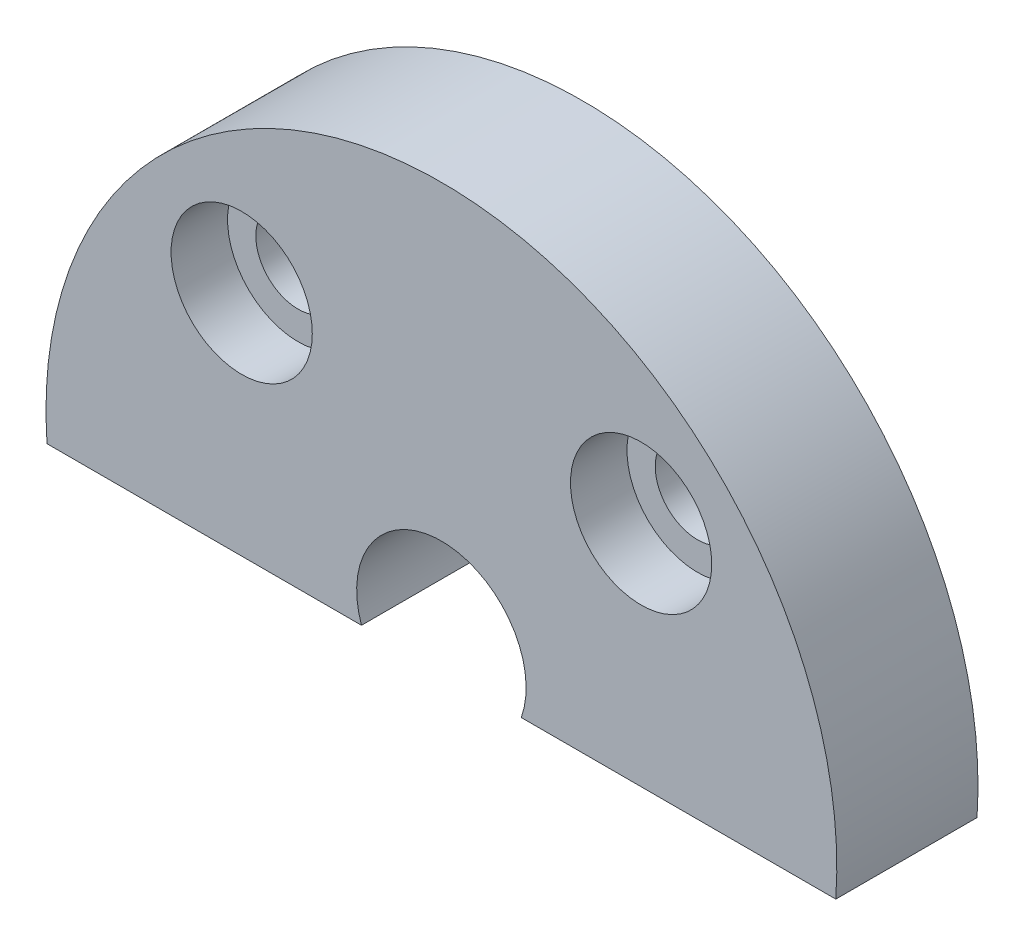
ISO-10303-21;
HEADER;
FILE_DESCRIPTION(('STEP AP214'),'2;1');
FILE_NAME('part.step','',(''),(''),'','','');
FILE_SCHEMA(('AUTOMOTIVE_DESIGN { 1 0 10303 214 1 1 1 1 }'));
ENDSEC;
DATA;
#1=APPLICATION_CONTEXT('core data for automotive mechanical design processes');
#2=APPLICATION_PROTOCOL_DEFINITION('international standard','automotive_design',2000,#1);
#3=PRODUCT_CONTEXT('',#1,'mechanical');
#4=PRODUCT('Part','Part','',(#3));
#5=PRODUCT_RELATED_PRODUCT_CATEGORY('part','',(#4));
#6=PRODUCT_DEFINITION_FORMATION('','',#4);
#7=PRODUCT_DEFINITION_CONTEXT('part definition',#1,'design');
#8=PRODUCT_DEFINITION('design','',#6,#7);
#9=PRODUCT_DEFINITION_SHAPE('','',#8);
#10=(LENGTH_UNIT() NAMED_UNIT(*) SI_UNIT(.MILLI.,.METRE.));
#11=(NAMED_UNIT(*) PLANE_ANGLE_UNIT() SI_UNIT($,.RADIAN.));
#12=(NAMED_UNIT(*) SI_UNIT($,.STERADIAN.) SOLID_ANGLE_UNIT());
#13=UNCERTAINTY_MEASURE_WITH_UNIT(LENGTH_MEASURE(1.E-05),#10,'distance_accuracy_value','');
#14=(GEOMETRIC_REPRESENTATION_CONTEXT(3) GLOBAL_UNCERTAINTY_ASSIGNED_CONTEXT((#13)) GLOBAL_UNIT_ASSIGNED_CONTEXT((#10,
#11,#12)) REPRESENTATION_CONTEXT('',''));
#15=CARTESIAN_POINT('',(0.,0.,0.));
#16=DIRECTION('',(0.,0.,1.));
#17=DIRECTION('',(1.,0.,0.));
#18=AXIS2_PLACEMENT_3D('',#15,#16,#17);
#19=CARTESIAN_POINT('',(7.07106781186548,7.07106781186548,5.));
#20=DIRECTION('',(0.,0.,-1.));
#21=DIRECTION('',(-1.,0.,0.));
#22=AXIS2_PLACEMENT_3D('',#19,#20,#21);
#23=CYLINDRICAL_SURFACE('',#22,1.5);
#24=CARTESIAN_POINT('',(7.07106781186548,7.07106781186548,0.));
#25=DIRECTION('',(0.,0.,1.));
#26=DIRECTION('',(1.,0.,0.));
#27=AXIS2_PLACEMENT_3D('',#24,#25,#26);
#28=CIRCLE('',#27,1.5);
#29=CARTESIAN_POINT('',(8.57106781186548,7.07106781186548,0.));
#30=VERTEX_POINT('',#29);
#31=EDGE_CURVE('E109',#30,#30,#28,.T.);
#32=ORIENTED_EDGE('',*,*,#31,.F.);
#33=EDGE_LOOP('',(#32));
#34=FACE_BOUND('',#33,.T.);
#35=CARTESIAN_POINT('',(7.07106781186548,7.07106781186548,3.));
#36=DIRECTION('',(0.,0.,1.));
#37=DIRECTION('',(1.,0.,0.));
#38=AXIS2_PLACEMENT_3D('',#35,#36,#37);
#39=CIRCLE('',#38,1.5);
#40=CARTESIAN_POINT('',(8.57106781186548,7.07106781186548,3.));
#41=VERTEX_POINT('',#40);
#42=EDGE_CURVE('E36',#41,#41,#39,.T.);
#43=ORIENTED_EDGE('',*,*,#42,.T.);
#44=EDGE_LOOP('',(#43));
#45=FACE_BOUND('',#44,.T.);
#46=ADVANCED_FACE('F32',(#34,#45),#23,.F.);
#47=CARTESIAN_POINT('',(-7.07106781186548,7.07106781186548,5.));
#48=DIRECTION('',(0.,0.,-1.));
#49=DIRECTION('',(-1.,0.,0.));
#50=AXIS2_PLACEMENT_3D('',#47,#48,#49);
#51=CYLINDRICAL_SURFACE('',#50,1.5);
#52=CARTESIAN_POINT('',(-7.07106781186548,7.07106781186548,0.));
#53=DIRECTION('',(0.,0.,1.));
#54=DIRECTION('',(1.,0.,0.));
#55=AXIS2_PLACEMENT_3D('',#52,#53,#54);
#56=CIRCLE('',#55,1.5);
#57=CARTESIAN_POINT('',(-5.57106781186548,7.07106781186548,0.));
#58=VERTEX_POINT('',#57);
#59=EDGE_CURVE('E102',#58,#58,#56,.T.);
#60=ORIENTED_EDGE('',*,*,#59,.F.);
#61=EDGE_LOOP('',(#60));
#62=FACE_BOUND('',#61,.T.);
#63=CARTESIAN_POINT('',(-7.07106781186548,7.07106781186548,3.));
#64=DIRECTION('',(0.,0.,1.));
#65=DIRECTION('',(1.,0.,0.));
#66=AXIS2_PLACEMENT_3D('',#63,#64,#65);
#67=CIRCLE('',#66,1.5);
#68=CARTESIAN_POINT('',(-5.57106781186548,7.07106781186548,3.));
#69=VERTEX_POINT('',#68);
#70=EDGE_CURVE('E107',#69,#69,#67,.T.);
#71=ORIENTED_EDGE('',*,*,#70,.T.);
#72=EDGE_LOOP('',(#71));
#73=FACE_BOUND('',#72,.T.);
#74=ADVANCED_FACE('F132',(#62,#73),#51,.F.);
#75=CARTESIAN_POINT('',(0.,0.,5.));
#76=DIRECTION('',(0.,0.,1.));
#77=DIRECTION('',(1.,0.,0.));
#78=AXIS2_PLACEMENT_3D('',#75,#76,#77);
#79=PLANE('',#78);
#80=CARTESIAN_POINT('',(7.07106781186548,7.07106781186548,5.));
#81=DIRECTION('',(0.,0.,1.));
#82=DIRECTION('',(1.,0.,0.));
#83=AXIS2_PLACEMENT_3D('',#80,#81,#82);
#84=CIRCLE('',#83,2.5);
#85=CARTESIAN_POINT('',(9.57106781186548,7.07106781186548,5.));
#86=VERTEX_POINT('',#85);
#87=EDGE_CURVE('E123',#86,#86,#84,.T.);
#88=ORIENTED_EDGE('',*,*,#87,.F.);
#89=EDGE_LOOP('',(#88));
#90=FACE_BOUND('',#89,.T.);
#91=CARTESIAN_POINT('',(-7.07106781186548,7.07106781186548,5.));
#92=DIRECTION('',(0.,0.,1.));
#93=DIRECTION('',(1.,0.,0.));
#94=AXIS2_PLACEMENT_3D('',#91,#92,#93);
#95=CIRCLE('',#94,2.5);
#96=CARTESIAN_POINT('',(-4.57106781186548,7.07106781186548,5.));
#97=VERTEX_POINT('',#96);
#98=EDGE_CURVE('E116',#97,#97,#95,.T.);
#99=ORIENTED_EDGE('',*,*,#98,.F.);
#100=EDGE_LOOP('',(#99));
#101=FACE_BOUND('',#100,.T.);
#102=CARTESIAN_POINT('',(0.,0.,5.));
#103=DIRECTION('',(0.,0.,1.));
#104=DIRECTION('',(1.,0.,0.));
#105=AXIS2_PLACEMENT_3D('',#102,#103,#104);
#106=CIRCLE('',#105,14.);
#107=CARTESIAN_POINT('',(13.9642400437689,-1.,5.));
#108=VERTEX_POINT('',#107);
#109=CARTESIAN_POINT('',(-13.9642400437689,-1.,5.));
#110=VERTEX_POINT('',#109);
#111=EDGE_CURVE('E86',#108,#110,#106,.T.);
#112=ORIENTED_EDGE('',*,*,#111,.T.);
#113=DIRECTION('',(1.,0.,0.));
#114=VECTOR('',#113,1.);
#115=CARTESIAN_POINT('',(-13.9642400437689,-1.,5.));
#116=LINE('',#115,#114);
#117=CARTESIAN_POINT('',(-2.82842712474619,-1.,5.));
#118=VERTEX_POINT('',#117);
#119=EDGE_CURVE('E81',#110,#118,#116,.T.);
#120=ORIENTED_EDGE('',*,*,#119,.T.);
#121=CARTESIAN_POINT('',(0.,0.,5.));
#122=DIRECTION('',(0.,0.,-1.));
#123=DIRECTION('',(1.,0.,0.));
#124=AXIS2_PLACEMENT_3D('',#121,#122,#123);
#125=CIRCLE('',#124,3.);
#126=CARTESIAN_POINT('',(2.82842712474619,-1.,5.));
#127=VERTEX_POINT('',#126);
#128=EDGE_CURVE('E84',#118,#127,#125,.T.);
#129=ORIENTED_EDGE('',*,*,#128,.T.);
#130=DIRECTION('',(1.,0.,0.));
#131=VECTOR('',#130,1.);
#132=CARTESIAN_POINT('',(2.82842712474619,-1.,5.));
#133=LINE('',#132,#131);
#134=EDGE_CURVE('E51',#127,#108,#133,.T.);
#135=ORIENTED_EDGE('',*,*,#134,.T.);
#136=EDGE_LOOP('',(#112,#120,#129,#135));
#137=FACE_BOUND('',#136,.T.);
#138=ADVANCED_FACE('F82',(#90,#101,#137),#79,.T.);
#139=CARTESIAN_POINT('',(0.,0.,0.));
#140=DIRECTION('',(0.,0.,1.));
#141=DIRECTION('',(1.,0.,0.));
#142=AXIS2_PLACEMENT_3D('',#139,#140,#141);
#143=PLANE('',#142);
#144=ORIENTED_EDGE('',*,*,#59,.T.);
#145=EDGE_LOOP('',(#144));
#146=FACE_BOUND('',#145,.T.);
#147=CARTESIAN_POINT('',(0.,0.,0.));
#148=DIRECTION('',(0.,0.,1.));
#149=DIRECTION('',(1.,0.,0.));
#150=AXIS2_PLACEMENT_3D('',#147,#148,#149);
#151=CIRCLE('',#150,14.);
#152=CARTESIAN_POINT('',(13.9642400437689,-1.,0.));
#153=VERTEX_POINT('',#152);
#154=CARTESIAN_POINT('',(-13.9642400437689,-1.,0.));
#155=VERTEX_POINT('',#154);
#156=EDGE_CURVE('E99',#153,#155,#151,.T.);
#157=ORIENTED_EDGE('',*,*,#156,.F.);
#158=DIRECTION('',(1.,0.,0.));
#159=VECTOR('',#158,1.);
#160=CARTESIAN_POINT('',(2.82842712474619,-1.,0.));
#161=LINE('',#160,#159);
#162=CARTESIAN_POINT('',(2.82842712474619,-1.,0.));
#163=VERTEX_POINT('',#162);
#164=EDGE_CURVE('E74',#163,#153,#161,.T.);
#165=ORIENTED_EDGE('',*,*,#164,.F.);
#166=CARTESIAN_POINT('',(0.,0.,0.));
#167=DIRECTION('',(0.,0.,-1.));
#168=DIRECTION('',(1.,0.,0.));
#169=AXIS2_PLACEMENT_3D('',#166,#167,#168);
#170=CIRCLE('',#169,3.);
#171=CARTESIAN_POINT('',(-2.82842712474619,-1.,0.));
#172=VERTEX_POINT('',#171);
#173=EDGE_CURVE('E68',#172,#163,#170,.T.);
#174=ORIENTED_EDGE('',*,*,#173,.F.);
#175=DIRECTION('',(1.,0.,0.));
#176=VECTOR('',#175,1.);
#177=CARTESIAN_POINT('',(-13.9642400437689,-1.,0.));
#178=LINE('',#177,#176);
#179=EDGE_CURVE('E90',#155,#172,#178,.T.);
#180=ORIENTED_EDGE('',*,*,#179,.F.);
#181=EDGE_LOOP('',(#157,#165,#174,#180));
#182=FACE_BOUND('',#181,.T.);
#183=ORIENTED_EDGE('',*,*,#31,.T.);
#184=EDGE_LOOP('',(#183));
#185=FACE_BOUND('',#184,.T.);
#186=ADVANCED_FACE('F129',(#146,#182,#185),#143,.F.);
#187=CARTESIAN_POINT('',(0.,0.,5.));
#188=DIRECTION('',(0.,0.,-1.));
#189=DIRECTION('',(-1.,0.,0.));
#190=AXIS2_PLACEMENT_3D('',#187,#188,#189);
#191=CYLINDRICAL_SURFACE('',#190,14.);
#192=ORIENTED_EDGE('',*,*,#156,.T.);
#193=DIRECTION('',(0.,0.,-1.));
#194=VECTOR('',#193,1.);
#195=CARTESIAN_POINT('',(-13.9642400437689,-1.,5.));
#196=LINE('',#195,#194);
#197=EDGE_CURVE('E11',#110,#155,#196,.T.);
#198=ORIENTED_EDGE('',*,*,#197,.F.);
#199=ORIENTED_EDGE('',*,*,#111,.F.);
#200=DIRECTION('',(0.,0.,-1.));
#201=VECTOR('',#200,1.);
#202=CARTESIAN_POINT('',(13.9642400437689,-1.,5.));
#203=LINE('',#202,#201);
#204=EDGE_CURVE('E95',#108,#153,#203,.T.);
#205=ORIENTED_EDGE('',*,*,#204,.T.);
#206=EDGE_LOOP('',(#192,#198,#199,#205));
#207=FACE_BOUND('',#206,.T.);
#208=ADVANCED_FACE('F34',(#207),#191,.T.);
#209=CARTESIAN_POINT('',(-13.9642400437689,-1.,5.));
#210=DIRECTION('',(0.,1.,0.));
#211=DIRECTION('',(0.,0.,1.));
#212=AXIS2_PLACEMENT_3D('',#209,#210,#211);
#213=PLANE('',#212);
#214=ORIENTED_EDGE('',*,*,#179,.T.);
#215=DIRECTION('',(0.,0.,-1.));
#216=VECTOR('',#215,1.);
#217=CARTESIAN_POINT('',(-2.82842712474619,-1.,5.));
#218=LINE('',#217,#216);
#219=EDGE_CURVE('E42',#118,#172,#218,.T.);
#220=ORIENTED_EDGE('',*,*,#219,.F.);
#221=ORIENTED_EDGE('',*,*,#119,.F.);
#222=ORIENTED_EDGE('',*,*,#197,.T.);
#223=EDGE_LOOP('',(#214,#220,#221,#222));
#224=FACE_BOUND('',#223,.T.);
#225=ADVANCED_FACE('F89',(#224),#213,.F.);
#226=CARTESIAN_POINT('',(0.,0.,5.));
#227=DIRECTION('',(0.,0.,-1.));
#228=DIRECTION('',(-1.,0.,0.));
#229=AXIS2_PLACEMENT_3D('',#226,#227,#228);
#230=CYLINDRICAL_SURFACE('',#229,3.);
#231=ORIENTED_EDGE('',*,*,#173,.T.);
#232=DIRECTION('',(0.,0.,-1.));
#233=VECTOR('',#232,1.);
#234=CARTESIAN_POINT('',(2.82842712474619,-1.,5.));
#235=LINE('',#234,#233);
#236=EDGE_CURVE('E91',#127,#163,#235,.T.);
#237=ORIENTED_EDGE('',*,*,#236,.F.);
#238=ORIENTED_EDGE('',*,*,#128,.F.);
#239=ORIENTED_EDGE('',*,*,#219,.T.);
#240=EDGE_LOOP('',(#231,#237,#238,#239));
#241=FACE_BOUND('',#240,.T.);
#242=ADVANCED_FACE('F93',(#241),#230,.F.);
#243=CARTESIAN_POINT('',(2.82842712474619,-1.,5.));
#244=DIRECTION('',(0.,1.,0.));
#245=DIRECTION('',(0.,0.,1.));
#246=AXIS2_PLACEMENT_3D('',#243,#244,#245);
#247=PLANE('',#246);
#248=ORIENTED_EDGE('',*,*,#164,.T.);
#249=ORIENTED_EDGE('',*,*,#204,.F.);
#250=ORIENTED_EDGE('',*,*,#134,.F.);
#251=ORIENTED_EDGE('',*,*,#236,.T.);
#252=EDGE_LOOP('',(#248,#249,#250,#251));
#253=FACE_BOUND('',#252,.T.);
#254=ADVANCED_FACE('F147',(#253),#247,.F.);
#255=CARTESIAN_POINT('',(-7.07106781186548,7.07106781186548,3.));
#256=DIRECTION('',(0.,0.,1.));
#257=DIRECTION('',(1.,0.,0.));
#258=AXIS2_PLACEMENT_3D('',#255,#256,#257);
#259=CYLINDRICAL_SURFACE('',#258,2.5);
#260=CARTESIAN_POINT('',(-7.07106781186548,7.07106781186548,3.));
#261=DIRECTION('',(0.,0.,1.));
#262=DIRECTION('',(1.,0.,0.));
#263=AXIS2_PLACEMENT_3D('',#260,#261,#262);
#264=CIRCLE('',#263,2.5);
#265=CARTESIAN_POINT('',(-4.57106781186548,7.07106781186548,3.));
#266=VERTEX_POINT('',#265);
#267=EDGE_CURVE('E110',#266,#266,#264,.T.);
#268=ORIENTED_EDGE('',*,*,#267,.F.);
#269=EDGE_LOOP('',(#268));
#270=FACE_BOUND('',#269,.T.);
#271=ORIENTED_EDGE('',*,*,#98,.T.);
#272=EDGE_LOOP('',(#271));
#273=FACE_BOUND('',#272,.T.);
#274=ADVANCED_FACE('F150',(#270,#273),#259,.F.);
#275=CARTESIAN_POINT('',(-7.07106781186548,7.07106781186548,3.));
#276=DIRECTION('',(0.,0.,1.));
#277=DIRECTION('',(1.,0.,0.));
#278=AXIS2_PLACEMENT_3D('',#275,#276,#277);
#279=PLANE('',#278);
#280=ORIENTED_EDGE('',*,*,#70,.F.);
#281=EDGE_LOOP('',(#280));
#282=FACE_BOUND('',#281,.T.);
#283=ORIENTED_EDGE('',*,*,#267,.T.);
#284=EDGE_LOOP('',(#283));
#285=FACE_BOUND('',#284,.T.);
#286=ADVANCED_FACE('F178',(#282,#285),#279,.T.);
#287=CARTESIAN_POINT('',(7.07106781186548,7.07106781186548,3.));
#288=DIRECTION('',(0.,0.,1.));
#289=DIRECTION('',(1.,0.,0.));
#290=AXIS2_PLACEMENT_3D('',#287,#288,#289);
#291=CYLINDRICAL_SURFACE('',#290,2.5);
#292=CARTESIAN_POINT('',(7.07106781186548,7.07106781186548,3.));
#293=DIRECTION('',(0.,0.,1.));
#294=DIRECTION('',(1.,0.,0.));
#295=AXIS2_PLACEMENT_3D('',#292,#293,#294);
#296=CIRCLE('',#295,2.5);
#297=CARTESIAN_POINT('',(9.57106781186548,7.07106781186548,3.));
#298=VERTEX_POINT('',#297);
#299=EDGE_CURVE('E166',#298,#298,#296,.T.);
#300=ORIENTED_EDGE('',*,*,#299,.F.);
#301=EDGE_LOOP('',(#300));
#302=FACE_BOUND('',#301,.T.);
#303=ORIENTED_EDGE('',*,*,#87,.T.);
#304=EDGE_LOOP('',(#303));
#305=FACE_BOUND('',#304,.T.);
#306=ADVANCED_FACE('F173',(#302,#305),#291,.F.);
#307=CARTESIAN_POINT('',(7.07106781186548,7.07106781186548,3.));
#308=DIRECTION('',(0.,0.,1.));
#309=DIRECTION('',(1.,0.,0.));
#310=AXIS2_PLACEMENT_3D('',#307,#308,#309);
#311=PLANE('',#310);
#312=ORIENTED_EDGE('',*,*,#42,.F.);
#313=EDGE_LOOP('',(#312));
#314=FACE_BOUND('',#313,.T.);
#315=ORIENTED_EDGE('',*,*,#299,.T.);
#316=EDGE_LOOP('',(#315));
#317=FACE_BOUND('',#316,.T.);
#318=ADVANCED_FACE('F188',(#314,#317),#311,.T.);
#319=CLOSED_SHELL('',(#46,#74,#138,#186,#208,#225,#242,#254,#274,#286,#306,#318));
#320=MANIFOLD_SOLID_BREP('B2',#319);
#321=ADVANCED_BREP_SHAPE_REPRESENTATION('',(#18,#320),#14);
#322=SHAPE_DEFINITION_REPRESENTATION(#9,#321);
ENDSEC;
END-ISO-10303-21;
